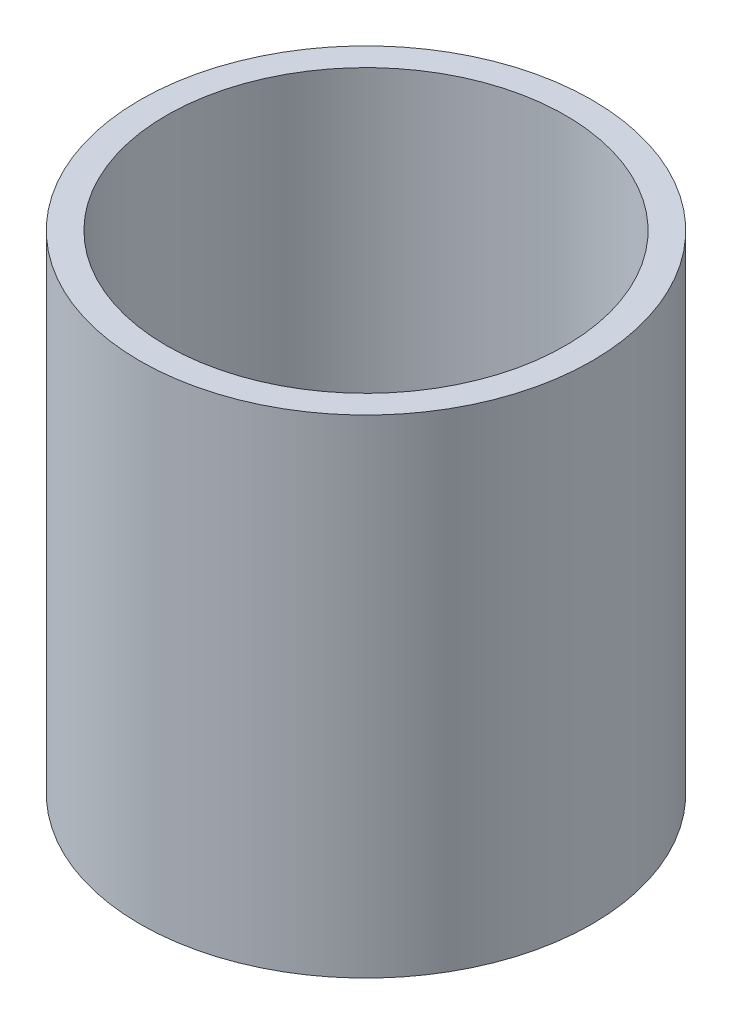
ISO-10303-21;
HEADER;
FILE_DESCRIPTION(('STEP AP214'),'2;1');
FILE_NAME('part.step','',(''),(''),'','','');
FILE_SCHEMA(('AUTOMOTIVE_DESIGN { 1 0 10303 214 1 1 1 1 }'));
ENDSEC;
DATA;
#1=APPLICATION_CONTEXT('core data for automotive mechanical design processes');
#2=APPLICATION_PROTOCOL_DEFINITION('international standard','automotive_design',2000,#1);
#3=PRODUCT_CONTEXT('',#1,'mechanical');
#4=PRODUCT('Part','Part','',(#3));
#5=PRODUCT_RELATED_PRODUCT_CATEGORY('part','',(#4));
#6=PRODUCT_DEFINITION_FORMATION('','',#4);
#7=PRODUCT_DEFINITION_CONTEXT('part definition',#1,'design');
#8=PRODUCT_DEFINITION('design','',#6,#7);
#9=PRODUCT_DEFINITION_SHAPE('','',#8);
#10=(LENGTH_UNIT() NAMED_UNIT(*) SI_UNIT(.MILLI.,.METRE.));
#11=(NAMED_UNIT(*) PLANE_ANGLE_UNIT() SI_UNIT($,.RADIAN.));
#12=(NAMED_UNIT(*) SI_UNIT($,.STERADIAN.) SOLID_ANGLE_UNIT());
#13=UNCERTAINTY_MEASURE_WITH_UNIT(LENGTH_MEASURE(1.E-05),#10,'distance_accuracy_value','');
#14=(GEOMETRIC_REPRESENTATION_CONTEXT(3) GLOBAL_UNCERTAINTY_ASSIGNED_CONTEXT((#13)) GLOBAL_UNIT_ASSIGNED_CONTEXT((#10,
#11,#12)) REPRESENTATION_CONTEXT('',''));
#15=CARTESIAN_POINT('',(0.,0.,0.));
#16=DIRECTION('',(0.,0.,1.));
#17=DIRECTION('',(1.,0.,0.));
#18=AXIS2_PLACEMENT_3D('',#15,#16,#17);
#19=CARTESIAN_POINT('',(0.,55.,0.));
#20=DIRECTION('',(0.,1.,0.));
#21=DIRECTION('',(0.,0.,1.));
#22=AXIS2_PLACEMENT_3D('',#19,#20,#21);
#23=PLANE('',#22);
#24=CARTESIAN_POINT('',(0.,55.,0.));
#25=DIRECTION('',(0.,1.,0.));
#26=DIRECTION('',(0.,0.,1.));
#27=AXIS2_PLACEMENT_3D('',#24,#25,#26);
#28=CIRCLE('',#27,25.5);
#29=CARTESIAN_POINT('',(0.,55.,25.5));
#30=VERTEX_POINT('',#29);
#31=EDGE_CURVE('E10',#30,#30,#28,.T.);
#32=ORIENTED_EDGE('',*,*,#31,.T.);
#33=EDGE_LOOP('',(#32));
#34=FACE_BOUND('',#33,.T.);
#35=CARTESIAN_POINT('',(0.,55.,0.));
#36=DIRECTION('',(0.,1.,0.));
#37=DIRECTION('',(0.,0.,1.));
#38=AXIS2_PLACEMENT_3D('',#35,#36,#37);
#39=CIRCLE('',#38,22.5);
#40=CARTESIAN_POINT('',(0.,55.,22.5));
#41=VERTEX_POINT('',#40);
#42=EDGE_CURVE('E42',#41,#41,#39,.T.);
#43=ORIENTED_EDGE('',*,*,#42,.F.);
#44=EDGE_LOOP('',(#43));
#45=FACE_BOUND('',#44,.T.);
#46=ADVANCED_FACE('F31',(#34,#45),#23,.T.);
#47=CARTESIAN_POINT('',(0.,0.,0.));
#48=DIRECTION('',(0.,1.,0.));
#49=DIRECTION('',(0.,0.,1.));
#50=AXIS2_PLACEMENT_3D('',#47,#48,#49);
#51=PLANE('',#50);
#52=CARTESIAN_POINT('',(0.,0.,0.));
#53=DIRECTION('',(0.,1.,0.));
#54=DIRECTION('',(0.,0.,1.));
#55=AXIS2_PLACEMENT_3D('',#52,#53,#54);
#56=CIRCLE('',#55,25.5);
#57=CARTESIAN_POINT('',(0.,0.,25.5));
#58=VERTEX_POINT('',#57);
#59=EDGE_CURVE('E35',#58,#58,#56,.T.);
#60=ORIENTED_EDGE('',*,*,#59,.F.);
#61=EDGE_LOOP('',(#60));
#62=FACE_BOUND('',#61,.T.);
#63=CARTESIAN_POINT('',(0.,0.,0.));
#64=DIRECTION('',(0.,1.,0.));
#65=DIRECTION('',(0.,0.,1.));
#66=AXIS2_PLACEMENT_3D('',#63,#64,#65);
#67=CIRCLE('',#66,22.5);
#68=CARTESIAN_POINT('',(0.,0.,22.5));
#69=VERTEX_POINT('',#68);
#70=EDGE_CURVE('E44',#69,#69,#67,.T.);
#71=ORIENTED_EDGE('',*,*,#70,.T.);
#72=EDGE_LOOP('',(#71));
#73=FACE_BOUND('',#72,.T.);
#74=ADVANCED_FACE('F54',(#62,#73),#51,.F.);
#75=CARTESIAN_POINT('',(0.,55.,0.));
#76=DIRECTION('',(0.,-1.,0.));
#77=DIRECTION('',(0.,0.,-1.));
#78=AXIS2_PLACEMENT_3D('',#75,#76,#77);
#79=CYLINDRICAL_SURFACE('',#78,25.5);
#80=ORIENTED_EDGE('',*,*,#31,.F.);
#81=EDGE_LOOP('',(#80));
#82=FACE_BOUND('',#81,.T.);
#83=ORIENTED_EDGE('',*,*,#59,.T.);
#84=EDGE_LOOP('',(#83));
#85=FACE_BOUND('',#84,.T.);
#86=ADVANCED_FACE('F33',(#82,#85),#79,.T.);
#87=CARTESIAN_POINT('',(0.,55.,0.));
#88=DIRECTION('',(0.,-1.,0.));
#89=DIRECTION('',(0.,0.,-1.));
#90=AXIS2_PLACEMENT_3D('',#87,#88,#89);
#91=CYLINDRICAL_SURFACE('',#90,22.5);
#92=ORIENTED_EDGE('',*,*,#42,.T.);
#93=EDGE_LOOP('',(#92));
#94=FACE_BOUND('',#93,.T.);
#95=ORIENTED_EDGE('',*,*,#70,.F.);
#96=EDGE_LOOP('',(#95));
#97=FACE_BOUND('',#96,.T.);
#98=ADVANCED_FACE('F50',(#94,#97),#91,.F.);
#99=CLOSED_SHELL('',(#46,#74,#86,#98));
#100=MANIFOLD_SOLID_BREP('B2',#99);
#101=ADVANCED_BREP_SHAPE_REPRESENTATION('',(#18,#100),#14);
#102=SHAPE_DEFINITION_REPRESENTATION(#9,#101);
ENDSEC;
END-ISO-10303-21;
